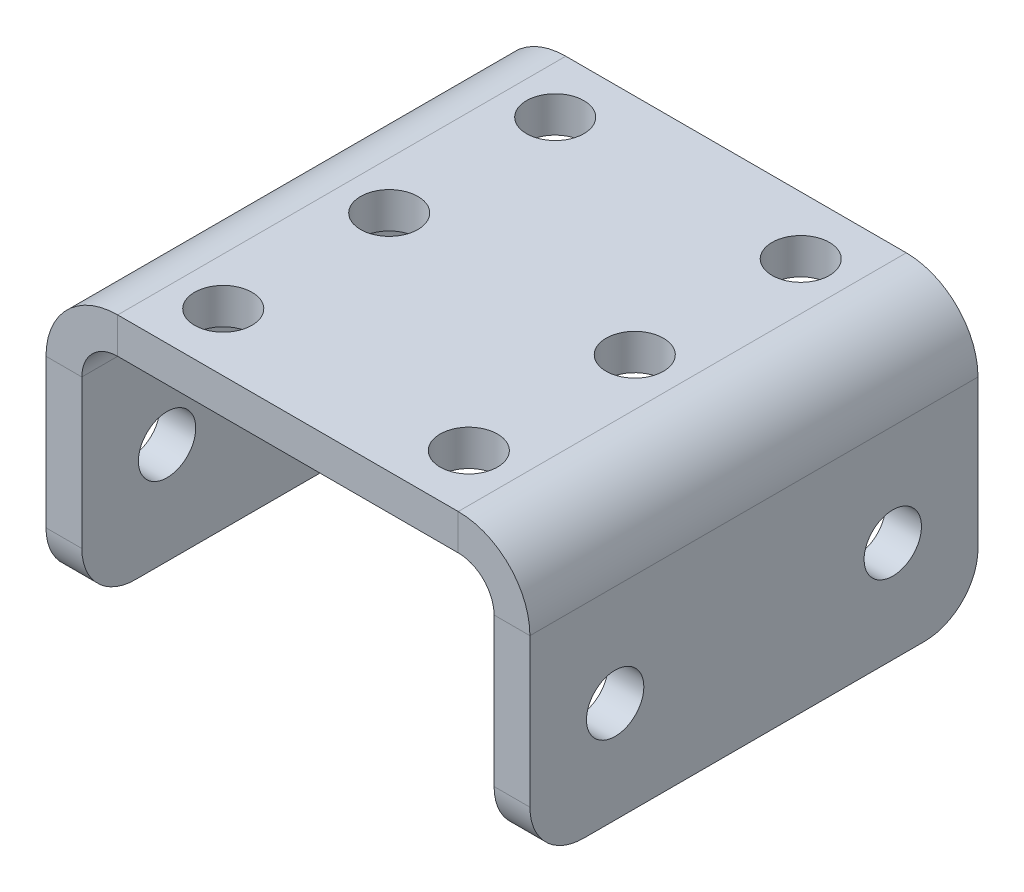
ISO-10303-21;
HEADER;
FILE_DESCRIPTION(('STEP AP214'),'2;1');
FILE_NAME('part.step','',(''),(''),'','','');
FILE_SCHEMA(('AUTOMOTIVE_DESIGN { 1 0 10303 214 1 1 1 1 }'));
ENDSEC;
DATA;
#1=APPLICATION_CONTEXT('core data for automotive mechanical design processes');
#2=APPLICATION_PROTOCOL_DEFINITION('international standard','automotive_design',2000,#1);
#3=PRODUCT_CONTEXT('',#1,'mechanical');
#4=PRODUCT('Part','Part','',(#3));
#5=PRODUCT_RELATED_PRODUCT_CATEGORY('part','',(#4));
#6=PRODUCT_DEFINITION_FORMATION('','',#4);
#7=PRODUCT_DEFINITION_CONTEXT('part definition',#1,'design');
#8=PRODUCT_DEFINITION('design','',#6,#7);
#9=PRODUCT_DEFINITION_SHAPE('','',#8);
#10=(LENGTH_UNIT() NAMED_UNIT(*) SI_UNIT(.MILLI.,.METRE.));
#11=(NAMED_UNIT(*) PLANE_ANGLE_UNIT() SI_UNIT($,.RADIAN.));
#12=(NAMED_UNIT(*) SI_UNIT($,.STERADIAN.) SOLID_ANGLE_UNIT());
#13=UNCERTAINTY_MEASURE_WITH_UNIT(LENGTH_MEASURE(1.E-05),#10,'distance_accuracy_value','');
#14=(GEOMETRIC_REPRESENTATION_CONTEXT(3) GLOBAL_UNCERTAINTY_ASSIGNED_CONTEXT((#13)) GLOBAL_UNIT_ASSIGNED_CONTEXT((#10,
#11,#12)) REPRESENTATION_CONTEXT('',''));
#15=CARTESIAN_POINT('',(0.,0.,0.));
#16=DIRECTION('',(0.,0.,1.));
#17=DIRECTION('',(1.,0.,0.));
#18=AXIS2_PLACEMENT_3D('',#15,#16,#17);
#19=CARTESIAN_POINT('',(-25.5,-2.,12.5));
#20=DIRECTION('',(0.,0.,1.));
#21=DIRECTION('',(1.,0.,0.));
#22=AXIS2_PLACEMENT_3D('',#19,#20,#21);
#23=PLANE('',#22);
#24=DIRECTION('',(1.,0.,0.));
#25=VECTOR('',#24,1.);
#26=CARTESIAN_POINT('',(-25.5,-2.,12.5));
#27=LINE('',#26,#25);
#28=CARTESIAN_POINT('',(-9.5,-2.,12.5));
#29=VERTEX_POINT('',#28);
#30=CARTESIAN_POINT('',(9.50000000000001,-2.,12.5));
#31=VERTEX_POINT('',#30);
#32=EDGE_CURVE('E275',#29,#31,#27,.T.);
#33=ORIENTED_EDGE('',*,*,#32,.T.);
#34=DIRECTION('',(0.,1.,0.));
#35=VECTOR('',#34,1.);
#36=CARTESIAN_POINT('',(9.50000000000001,-2.,12.5));
#37=LINE('',#36,#35);
#38=CARTESIAN_POINT('',(9.50000000000001,0.,12.5));
#39=VERTEX_POINT('',#38);
#40=EDGE_CURVE('E283',#31,#39,#37,.T.);
#41=ORIENTED_EDGE('',*,*,#40,.T.);
#42=DIRECTION('',(1.,0.,0.));
#43=VECTOR('',#42,1.);
#44=CARTESIAN_POINT('',(-25.5,0.,12.5));
#45=LINE('',#44,#43);
#46=CARTESIAN_POINT('',(-9.5,0.,12.5));
#47=VERTEX_POINT('',#46);
#48=EDGE_CURVE('E238',#47,#39,#45,.T.);
#49=ORIENTED_EDGE('',*,*,#48,.F.);
#50=DIRECTION('',(0.,1.,0.));
#51=VECTOR('',#50,1.);
#52=CARTESIAN_POINT('',(-9.5,-2.,12.5));
#53=LINE('',#52,#51);
#54=EDGE_CURVE('E244',#29,#47,#53,.T.);
#55=ORIENTED_EDGE('',*,*,#54,.F.);
#56=EDGE_LOOP('',(#33,#41,#49,#55));
#57=FACE_BOUND('',#56,.T.);
#58=ADVANCED_FACE('F58',(#57),#23,.T.);
#59=CARTESIAN_POINT('',(-25.5,-2.,-12.5));
#60=DIRECTION('',(0.,0.,-1.));
#61=DIRECTION('',(-1.,0.,0.));
#62=AXIS2_PLACEMENT_3D('',#59,#60,#61);
#63=PLANE('',#62);
#64=DIRECTION('',(-1.,0.,0.));
#65=VECTOR('',#64,1.);
#66=CARTESIAN_POINT('',(-25.5,0.,-12.5));
#67=LINE('',#66,#65);
#68=CARTESIAN_POINT('',(9.50000000000001,0.,-12.5));
#69=VERTEX_POINT('',#68);
#70=CARTESIAN_POINT('',(-9.5,0.,-12.5));
#71=VERTEX_POINT('',#70);
#72=EDGE_CURVE('E239',#69,#71,#67,.T.);
#73=ORIENTED_EDGE('',*,*,#72,.F.);
#74=DIRECTION('',(0.,-1.,0.));
#75=VECTOR('',#74,1.);
#76=CARTESIAN_POINT('',(9.50000000000001,-2.,-12.5));
#77=LINE('',#76,#75);
#78=CARTESIAN_POINT('',(9.50000000000001,-2.,-12.5));
#79=VERTEX_POINT('',#78);
#80=EDGE_CURVE('E278',#69,#79,#77,.T.);
#81=ORIENTED_EDGE('',*,*,#80,.T.);
#82=DIRECTION('',(-1.,0.,0.));
#83=VECTOR('',#82,1.);
#84=CARTESIAN_POINT('',(-25.5,-2.,-12.5));
#85=LINE('',#84,#83);
#86=CARTESIAN_POINT('',(-9.5,-2.,-12.5));
#87=VERTEX_POINT('',#86);
#88=EDGE_CURVE('E243',#79,#87,#85,.T.);
#89=ORIENTED_EDGE('',*,*,#88,.T.);
#90=DIRECTION('',(0.,-1.,0.));
#91=VECTOR('',#90,1.);
#92=CARTESIAN_POINT('',(-9.5,-2.,-12.5));
#93=LINE('',#92,#91);
#94=EDGE_CURVE('E240',#71,#87,#93,.T.);
#95=ORIENTED_EDGE('',*,*,#94,.F.);
#96=EDGE_LOOP('',(#73,#81,#89,#95));
#97=FACE_BOUND('',#96,.T.);
#98=ADVANCED_FACE('F367',(#97),#63,.T.);
#99=CARTESIAN_POINT('',(0.,-2.,0.));
#100=DIRECTION('',(0.,-1.,0.));
#101=DIRECTION('',(0.,0.,-1.));
#102=AXIS2_PLACEMENT_3D('',#99,#100,#101);
#103=PLANE('',#102);
#104=CARTESIAN_POINT('',(6.85,-2.,9.26));
#105=DIRECTION('',(0.,-1.,0.));
#106=DIRECTION('',(0.,0.,-1.));
#107=AXIS2_PLACEMENT_3D('',#104,#105,#106);
#108=CIRCLE('',#107,1.6);
#109=CARTESIAN_POINT('',(6.85,-2.,7.66));
#110=VERTEX_POINT('',#109);
#111=EDGE_CURVE('E525',#110,#110,#108,.T.);
#112=ORIENTED_EDGE('',*,*,#111,.F.);
#113=EDGE_LOOP('',(#112));
#114=FACE_BOUND('',#113,.T.);
#115=CARTESIAN_POINT('',(6.85,-2.,-9.26));
#116=DIRECTION('',(0.,-1.,0.));
#117=DIRECTION('',(0.,0.,-1.));
#118=AXIS2_PLACEMENT_3D('',#115,#116,#117);
#119=CIRCLE('',#118,1.6);
#120=CARTESIAN_POINT('',(6.85,-2.,-10.86));
#121=VERTEX_POINT('',#120);
#122=EDGE_CURVE('E528',#121,#121,#119,.T.);
#123=ORIENTED_EDGE('',*,*,#122,.F.);
#124=EDGE_LOOP('',(#123));
#125=FACE_BOUND('',#124,.T.);
#126=CARTESIAN_POINT('',(-6.85,-2.,-9.26));
#127=DIRECTION('',(0.,-1.,0.));
#128=DIRECTION('',(0.,0.,-1.));
#129=AXIS2_PLACEMENT_3D('',#126,#127,#128);
#130=CIRCLE('',#129,1.6);
#131=CARTESIAN_POINT('',(-6.85,-2.,-10.86));
#132=VERTEX_POINT('',#131);
#133=EDGE_CURVE('E522',#132,#132,#130,.T.);
#134=ORIENTED_EDGE('',*,*,#133,.F.);
#135=EDGE_LOOP('',(#134));
#136=FACE_BOUND('',#135,.T.);
#137=CARTESIAN_POINT('',(-6.85,-2.,0.));
#138=DIRECTION('',(0.,-1.,0.));
#139=DIRECTION('',(0.,0.,-1.));
#140=AXIS2_PLACEMENT_3D('',#137,#138,#139);
#141=CIRCLE('',#140,1.6);
#142=CARTESIAN_POINT('',(-6.85,-2.,-1.6));
#143=VERTEX_POINT('',#142);
#144=EDGE_CURVE('E519',#143,#143,#141,.T.);
#145=ORIENTED_EDGE('',*,*,#144,.F.);
#146=EDGE_LOOP('',(#145));
#147=FACE_BOUND('',#146,.T.);
#148=CARTESIAN_POINT('',(6.85,-2.,0.));
#149=DIRECTION('',(0.,-1.,0.));
#150=DIRECTION('',(0.,0.,-1.));
#151=AXIS2_PLACEMENT_3D('',#148,#149,#150);
#152=CIRCLE('',#151,1.6);
#153=CARTESIAN_POINT('',(6.85,-2.,-1.6));
#154=VERTEX_POINT('',#153);
#155=EDGE_CURVE('E512',#154,#154,#152,.T.);
#156=ORIENTED_EDGE('',*,*,#155,.F.);
#157=EDGE_LOOP('',(#156));
#158=FACE_BOUND('',#157,.T.);
#159=CARTESIAN_POINT('',(-6.85,-2.,9.26));
#160=DIRECTION('',(0.,-1.,0.));
#161=DIRECTION('',(0.,0.,-1.));
#162=AXIS2_PLACEMENT_3D('',#159,#160,#161);
#163=CIRCLE('',#162,1.6);
#164=CARTESIAN_POINT('',(-6.85,-2.,7.66));
#165=VERTEX_POINT('',#164);
#166=EDGE_CURVE('E297',#165,#165,#163,.T.);
#167=ORIENTED_EDGE('',*,*,#166,.F.);
#168=EDGE_LOOP('',(#167));
#169=FACE_BOUND('',#168,.T.);
#170=ORIENTED_EDGE('',*,*,#88,.F.);
#171=DIRECTION('',(0.,0.,1.));
#172=VECTOR('',#171,1.);
#173=CARTESIAN_POINT('',(9.50000000000001,-2.,0.));
#174=LINE('',#173,#172);
#175=EDGE_CURVE('E211',#79,#31,#174,.T.);
#176=ORIENTED_EDGE('',*,*,#175,.T.);
#177=ORIENTED_EDGE('',*,*,#32,.F.);
#178=DIRECTION('',(0.,0.,1.));
#179=VECTOR('',#178,1.);
#180=CARTESIAN_POINT('',(-9.5,-2.,0.));
#181=LINE('',#180,#179);
#182=EDGE_CURVE('E230',#87,#29,#181,.T.);
#183=ORIENTED_EDGE('',*,*,#182,.F.);
#184=EDGE_LOOP('',(#170,#176,#177,#183));
#185=FACE_BOUND('',#184,.T.);
#186=ADVANCED_FACE('F378',(#114,#125,#136,#147,#158,#169,#185),#103,.T.);
#187=CARTESIAN_POINT('',(-11.5,-15.2876110196153,12.5));
#188=DIRECTION('',(0.,0.,1.));
#189=DIRECTION('',(0.,1.,0.));
#190=AXIS2_PLACEMENT_3D('',#187,#188,#189);
#191=PLANE('',#190);
#192=DIRECTION('',(0.,1.,0.));
#193=VECTOR('',#192,1.);
#194=CARTESIAN_POINT('',(-13.5,-15.2876110196153,12.5));
#195=LINE('',#194,#193);
#196=CARTESIAN_POINT('',(-13.5,-12.2876110196153,12.5));
#197=VERTEX_POINT('',#196);
#198=CARTESIAN_POINT('',(-13.5,-4.00000000000001,12.5));
#199=VERTEX_POINT('',#198);
#200=EDGE_CURVE('E257',#197,#199,#195,.T.);
#201=ORIENTED_EDGE('',*,*,#200,.F.);
#202=DIRECTION('',(-1.,0.,0.));
#203=VECTOR('',#202,1.);
#204=CARTESIAN_POINT('',(-11.5,-12.2876110196153,12.5));
#205=LINE('',#204,#203);
#206=CARTESIAN_POINT('',(-11.5,-12.2876110196153,12.5));
#207=VERTEX_POINT('',#206);
#208=EDGE_CURVE('E81',#197,#207,#205,.F.);
#209=ORIENTED_EDGE('',*,*,#208,.T.);
#210=DIRECTION('',(0.,1.,0.));
#211=VECTOR('',#210,1.);
#212=CARTESIAN_POINT('',(-11.5,-15.2876110196153,12.5));
#213=LINE('',#212,#211);
#214=CARTESIAN_POINT('',(-11.5,-4.00000000000001,12.5));
#215=VERTEX_POINT('',#214);
#216=EDGE_CURVE('E252',#207,#215,#213,.T.);
#217=ORIENTED_EDGE('',*,*,#216,.T.);
#218=DIRECTION('',(-1.,0.,0.));
#219=VECTOR('',#218,1.);
#220=CARTESIAN_POINT('',(-11.5,-4.00000000000001,12.5));
#221=LINE('',#220,#219);
#222=EDGE_CURVE('E268',#215,#199,#221,.T.);
#223=ORIENTED_EDGE('',*,*,#222,.T.);
#224=EDGE_LOOP('',(#201,#209,#217,#223));
#225=FACE_BOUND('',#224,.T.);
#226=ADVANCED_FACE('F351',(#225),#191,.T.);
#227=CARTESIAN_POINT('',(-11.5,-15.2876110196153,-12.5));
#228=DIRECTION('',(0.,0.,-1.));
#229=DIRECTION('',(0.,-1.,0.));
#230=AXIS2_PLACEMENT_3D('',#227,#228,#229);
#231=PLANE('',#230);
#232=DIRECTION('',(0.,-1.,0.));
#233=VECTOR('',#232,1.);
#234=CARTESIAN_POINT('',(-11.5,-15.2876110196153,-12.5));
#235=LINE('',#234,#233);
#236=CARTESIAN_POINT('',(-11.5,-4.00000000000001,-12.5));
#237=VERTEX_POINT('',#236);
#238=CARTESIAN_POINT('',(-11.5,-12.2876110196153,-12.5));
#239=VERTEX_POINT('',#238);
#240=EDGE_CURVE('E253',#237,#239,#235,.T.);
#241=ORIENTED_EDGE('',*,*,#240,.T.);
#242=DIRECTION('',(-1.,0.,0.));
#243=VECTOR('',#242,1.);
#244=CARTESIAN_POINT('',(-11.5,-12.2876110196153,-12.5));
#245=LINE('',#244,#243);
#246=CARTESIAN_POINT('',(-13.5,-12.2876110196153,-12.5));
#247=VERTEX_POINT('',#246);
#248=EDGE_CURVE('E12',#239,#247,#245,.T.);
#249=ORIENTED_EDGE('',*,*,#248,.T.);
#250=DIRECTION('',(0.,-1.,0.));
#251=VECTOR('',#250,1.);
#252=CARTESIAN_POINT('',(-13.5,-15.2876110196153,-12.5));
#253=LINE('',#252,#251);
#254=CARTESIAN_POINT('',(-13.5,-4.00000000000001,-12.5));
#255=VERTEX_POINT('',#254);
#256=EDGE_CURVE('E258',#255,#247,#253,.T.);
#257=ORIENTED_EDGE('',*,*,#256,.F.);
#258=DIRECTION('',(1.,0.,0.));
#259=VECTOR('',#258,1.);
#260=CARTESIAN_POINT('',(-11.5,-4.00000000000001,-12.5));
#261=LINE('',#260,#259);
#262=EDGE_CURVE('E262',#255,#237,#261,.T.);
#263=ORIENTED_EDGE('',*,*,#262,.T.);
#264=EDGE_LOOP('',(#241,#249,#257,#263));
#265=FACE_BOUND('',#264,.T.);
#266=ADVANCED_FACE('F439',(#265),#231,.T.);
#267=CARTESIAN_POINT('',(-11.5,10.2123889803847,0.));
#268=DIRECTION('',(1.,0.,0.));
#269=DIRECTION('',(0.,0.,-1.));
#270=AXIS2_PLACEMENT_3D('',#267,#268,#269);
#271=PLANE('',#270);
#272=CARTESIAN_POINT('',(-11.5,-9.64380550980757,7.745));
#273=DIRECTION('',(1.,0.,0.));
#274=DIRECTION('',(0.,1.,0.));
#275=AXIS2_PLACEMENT_3D('',#272,#273,#274);
#276=CIRCLE('',#275,1.6);
#277=CARTESIAN_POINT('',(-11.5,-8.04380550980757,7.745));
#278=VERTEX_POINT('',#277);
#279=EDGE_CURVE('E199',#278,#278,#276,.T.);
#280=ORIENTED_EDGE('',*,*,#279,.F.);
#281=EDGE_LOOP('',(#280));
#282=FACE_BOUND('',#281,.T.);
#283=CARTESIAN_POINT('',(-11.5,-9.64380550980757,-7.745));
#284=DIRECTION('',(1.,0.,0.));
#285=DIRECTION('',(0.,1.,0.));
#286=AXIS2_PLACEMENT_3D('',#283,#284,#285);
#287=CIRCLE('',#286,1.6);
#288=CARTESIAN_POINT('',(-11.5,-8.04380550980757,-7.745));
#289=VERTEX_POINT('',#288);
#290=EDGE_CURVE('E546',#289,#289,#287,.T.);
#291=ORIENTED_EDGE('',*,*,#290,.F.);
#292=EDGE_LOOP('',(#291));
#293=FACE_BOUND('',#292,.T.);
#294=ORIENTED_EDGE('',*,*,#216,.F.);
#295=CARTESIAN_POINT('',(-11.5,-12.2876110196153,9.5));
#296=DIRECTION('',(1.,0.,0.));
#297=DIRECTION('',(0.,1.,0.));
#298=AXIS2_PLACEMENT_3D('',#295,#296,#297);
#299=CIRCLE('',#298,3.);
#300=CARTESIAN_POINT('',(-11.5,-15.2876110196153,9.5));
#301=VERTEX_POINT('',#300);
#302=EDGE_CURVE('E66',#207,#301,#299,.T.);
#303=ORIENTED_EDGE('',*,*,#302,.T.);
#304=DIRECTION('',(0.,0.,1.));
#305=VECTOR('',#304,1.);
#306=CARTESIAN_POINT('',(-11.5,-15.2876110196153,12.5));
#307=LINE('',#306,#305);
#308=CARTESIAN_POINT('',(-11.5,-15.2876110196153,-9.5));
#309=VERTEX_POINT('',#308);
#310=EDGE_CURVE('E249',#309,#301,#307,.T.);
#311=ORIENTED_EDGE('',*,*,#310,.F.);
#312=CARTESIAN_POINT('',(-11.5,-12.2876110196153,-9.5));
#313=DIRECTION('',(1.,0.,0.));
#314=DIRECTION('',(0.,1.,0.));
#315=AXIS2_PLACEMENT_3D('',#312,#313,#314);
#316=CIRCLE('',#315,3.);
#317=EDGE_CURVE('E73',#309,#239,#316,.T.);
#318=ORIENTED_EDGE('',*,*,#317,.T.);
#319=ORIENTED_EDGE('',*,*,#240,.F.);
#320=DIRECTION('',(0.,0.,1.));
#321=VECTOR('',#320,1.);
#322=CARTESIAN_POINT('',(-11.5,-4.00000000000001,0.));
#323=LINE('',#322,#321);
#324=EDGE_CURVE('E259',#237,#215,#323,.T.);
#325=ORIENTED_EDGE('',*,*,#324,.T.);
#326=EDGE_LOOP('',(#294,#303,#311,#318,#319,#325));
#327=FACE_BOUND('',#326,.T.);
#328=ADVANCED_FACE('F340',(#282,#293,#327),#271,.T.);
#329=CARTESIAN_POINT('',(-11.5,-15.2876110196153,12.5));
#330=DIRECTION('',(0.,-1.,0.));
#331=DIRECTION('',(0.,0.,1.));
#332=AXIS2_PLACEMENT_3D('',#329,#330,#331);
#333=PLANE('',#332);
#334=ORIENTED_EDGE('',*,*,#310,.T.);
#335=DIRECTION('',(-1.,0.,0.));
#336=VECTOR('',#335,1.);
#337=CARTESIAN_POINT('',(-11.5,-15.2876110196153,9.5));
#338=LINE('',#337,#336);
#339=CARTESIAN_POINT('',(-13.5,-15.2876110196153,9.5));
#340=VERTEX_POINT('',#339);
#341=EDGE_CURVE('E331',#301,#340,#338,.T.);
#342=ORIENTED_EDGE('',*,*,#341,.T.);
#343=DIRECTION('',(0.,0.,1.));
#344=VECTOR('',#343,1.);
#345=CARTESIAN_POINT('',(-13.5,-15.2876110196153,12.5));
#346=LINE('',#345,#344);
#347=CARTESIAN_POINT('',(-13.5,-15.2876110196153,-9.5));
#348=VERTEX_POINT('',#347);
#349=EDGE_CURVE('E254',#348,#340,#346,.T.);
#350=ORIENTED_EDGE('',*,*,#349,.F.);
#351=DIRECTION('',(-1.,0.,0.));
#352=VECTOR('',#351,1.);
#353=CARTESIAN_POINT('',(-11.5,-15.2876110196153,-9.5));
#354=LINE('',#353,#352);
#355=EDGE_CURVE('E329',#348,#309,#354,.F.);
#356=ORIENTED_EDGE('',*,*,#355,.T.);
#357=EDGE_LOOP('',(#334,#342,#350,#356));
#358=FACE_BOUND('',#357,.T.);
#359=ADVANCED_FACE('F344',(#358),#333,.T.);
#360=CARTESIAN_POINT('',(-13.5,10.2123889803847,0.));
#361=DIRECTION('',(1.,0.,0.));
#362=DIRECTION('',(0.,0.,-1.));
#363=AXIS2_PLACEMENT_3D('',#360,#361,#362);
#364=PLANE('',#363);
#365=CARTESIAN_POINT('',(-13.5,-9.64380550980756,7.745));
#366=DIRECTION('',(1.,0.,0.));
#367=DIRECTION('',(0.,1.,0.));
#368=AXIS2_PLACEMENT_3D('',#365,#366,#367);
#369=CIRCLE('',#368,1.6);
#370=CARTESIAN_POINT('',(-13.5,-8.04380550980756,7.745));
#371=VERTEX_POINT('',#370);
#372=EDGE_CURVE('E552',#371,#371,#369,.T.);
#373=ORIENTED_EDGE('',*,*,#372,.T.);
#374=EDGE_LOOP('',(#373));
#375=FACE_BOUND('',#374,.T.);
#376=CARTESIAN_POINT('',(-13.5,-9.64380550980756,-7.745));
#377=DIRECTION('',(1.,0.,0.));
#378=DIRECTION('',(0.,1.,0.));
#379=AXIS2_PLACEMENT_3D('',#376,#377,#378);
#380=CIRCLE('',#379,1.6);
#381=CARTESIAN_POINT('',(-13.5,-8.04380550980756,-7.745));
#382=VERTEX_POINT('',#381);
#383=EDGE_CURVE('E543',#382,#382,#380,.T.);
#384=ORIENTED_EDGE('',*,*,#383,.T.);
#385=EDGE_LOOP('',(#384));
#386=FACE_BOUND('',#385,.T.);
#387=ORIENTED_EDGE('',*,*,#349,.T.);
#388=CARTESIAN_POINT('',(-13.5,-12.2876110196153,9.5));
#389=DIRECTION('',(1.,0.,0.));
#390=DIRECTION('',(0.,1.,0.));
#391=AXIS2_PLACEMENT_3D('',#388,#389,#390);
#392=CIRCLE('',#391,3.);
#393=EDGE_CURVE('E336',#340,#197,#392,.F.);
#394=ORIENTED_EDGE('',*,*,#393,.T.);
#395=ORIENTED_EDGE('',*,*,#200,.T.);
#396=DIRECTION('',(0.,0.,1.));
#397=VECTOR('',#396,1.);
#398=CARTESIAN_POINT('',(-13.5,-4.00000000000001,0.));
#399=LINE('',#398,#397);
#400=EDGE_CURVE('E265',#255,#199,#399,.T.);
#401=ORIENTED_EDGE('',*,*,#400,.F.);
#402=ORIENTED_EDGE('',*,*,#256,.T.);
#403=CARTESIAN_POINT('',(-13.5,-12.2876110196153,-9.5));
#404=DIRECTION('',(1.,0.,0.));
#405=DIRECTION('',(0.,1.,0.));
#406=AXIS2_PLACEMENT_3D('',#403,#404,#405);
#407=CIRCLE('',#406,3.);
#408=EDGE_CURVE('E334',#247,#348,#407,.F.);
#409=ORIENTED_EDGE('',*,*,#408,.T.);
#410=EDGE_LOOP('',(#387,#394,#395,#401,#402,#409));
#411=FACE_BOUND('',#410,.T.);
#412=ADVANCED_FACE('F349',(#375,#386,#411),#364,.F.);
#413=CARTESIAN_POINT('',(0.,0.,0.));
#414=DIRECTION('',(0.,-1.,0.));
#415=DIRECTION('',(0.,0.,-1.));
#416=AXIS2_PLACEMENT_3D('',#413,#414,#415);
#417=PLANE('',#416);
#418=CARTESIAN_POINT('',(6.85,0.,9.26));
#419=DIRECTION('',(0.,-1.,0.));
#420=DIRECTION('',(0.,0.,-1.));
#421=AXIS2_PLACEMENT_3D('',#418,#419,#420);
#422=CIRCLE('',#421,1.6);
#423=CARTESIAN_POINT('',(6.85,0.,7.66));
#424=VERTEX_POINT('',#423);
#425=EDGE_CURVE('E309',#424,#424,#422,.T.);
#426=ORIENTED_EDGE('',*,*,#425,.T.);
#427=EDGE_LOOP('',(#426));
#428=FACE_BOUND('',#427,.T.);
#429=CARTESIAN_POINT('',(6.85,0.,-9.26));
#430=DIRECTION('',(0.,-1.,0.));
#431=DIRECTION('',(0.,0.,-1.));
#432=AXIS2_PLACEMENT_3D('',#429,#430,#431);
#433=CIRCLE('',#432,1.6);
#434=CARTESIAN_POINT('',(6.85,0.,-10.86));
#435=VERTEX_POINT('',#434);
#436=EDGE_CURVE('E306',#435,#435,#433,.T.);
#437=ORIENTED_EDGE('',*,*,#436,.T.);
#438=EDGE_LOOP('',(#437));
#439=FACE_BOUND('',#438,.T.);
#440=CARTESIAN_POINT('',(-6.85,0.,-9.26));
#441=DIRECTION('',(0.,-1.,0.));
#442=DIRECTION('',(0.,0.,-1.));
#443=AXIS2_PLACEMENT_3D('',#440,#441,#442);
#444=CIRCLE('',#443,1.6);
#445=CARTESIAN_POINT('',(-6.85,0.,-10.86));
#446=VERTEX_POINT('',#445);
#447=EDGE_CURVE('E303',#446,#446,#444,.T.);
#448=ORIENTED_EDGE('',*,*,#447,.T.);
#449=EDGE_LOOP('',(#448));
#450=FACE_BOUND('',#449,.T.);
#451=CARTESIAN_POINT('',(-6.85,0.,0.));
#452=DIRECTION('',(0.,-1.,0.));
#453=DIRECTION('',(0.,0.,-1.));
#454=AXIS2_PLACEMENT_3D('',#451,#452,#453);
#455=CIRCLE('',#454,1.6);
#456=CARTESIAN_POINT('',(-6.85,0.,-1.6));
#457=VERTEX_POINT('',#456);
#458=EDGE_CURVE('E300',#457,#457,#455,.T.);
#459=ORIENTED_EDGE('',*,*,#458,.T.);
#460=EDGE_LOOP('',(#459));
#461=FACE_BOUND('',#460,.T.);
#462=CARTESIAN_POINT('',(6.85,0.,0.));
#463=DIRECTION('',(0.,-1.,0.));
#464=DIRECTION('',(0.,0.,-1.));
#465=AXIS2_PLACEMENT_3D('',#462,#463,#464);
#466=CIRCLE('',#465,1.6);
#467=CARTESIAN_POINT('',(6.85,0.,-1.6));
#468=VERTEX_POINT('',#467);
#469=EDGE_CURVE('E296',#468,#468,#466,.T.);
#470=ORIENTED_EDGE('',*,*,#469,.T.);
#471=EDGE_LOOP('',(#470));
#472=FACE_BOUND('',#471,.T.);
#473=CARTESIAN_POINT('',(-6.85,0.,9.26));
#474=DIRECTION('',(0.,-1.,0.));
#475=DIRECTION('',(0.,0.,-1.));
#476=AXIS2_PLACEMENT_3D('',#473,#474,#475);
#477=CIRCLE('',#476,1.6);
#478=CARTESIAN_POINT('',(-6.85,0.,7.66));
#479=VERTEX_POINT('',#478);
#480=EDGE_CURVE('E293',#479,#479,#477,.T.);
#481=ORIENTED_EDGE('',*,*,#480,.T.);
#482=EDGE_LOOP('',(#481));
#483=FACE_BOUND('',#482,.T.);
#484=DIRECTION('',(0.,0.,1.));
#485=VECTOR('',#484,1.);
#486=CARTESIAN_POINT('',(9.50000000000001,0.,0.));
#487=LINE('',#486,#485);
#488=EDGE_CURVE('E281',#69,#39,#487,.T.);
#489=ORIENTED_EDGE('',*,*,#488,.F.);
#490=ORIENTED_EDGE('',*,*,#72,.T.);
#491=DIRECTION('',(0.,0.,1.));
#492=VECTOR('',#491,1.);
#493=CARTESIAN_POINT('',(-9.5,0.,0.));
#494=LINE('',#493,#492);
#495=EDGE_CURVE('E235',#71,#47,#494,.T.);
#496=ORIENTED_EDGE('',*,*,#495,.T.);
#497=ORIENTED_EDGE('',*,*,#48,.T.);
#498=EDGE_LOOP('',(#489,#490,#496,#497));
#499=FACE_BOUND('',#498,.T.);
#500=ADVANCED_FACE('F374',(#428,#439,#450,#461,#472,#483,#499),#417,.F.);
#501=CARTESIAN_POINT('',(-9.5,-4.,-12.5));
#502=DIRECTION('',(0.,0.,1.));
#503=DIRECTION('',(1.,0.,0.));
#504=AXIS2_PLACEMENT_3D('',#501,#502,#503);
#505=PLANE('',#504);
#506=ORIENTED_EDGE('',*,*,#262,.F.);
#507=CARTESIAN_POINT('',(-9.5,-4.,-12.5));
#508=DIRECTION('',(0.,0.,-1.));
#509=DIRECTION('',(-1.,0.,0.));
#510=AXIS2_PLACEMENT_3D('',#507,#508,#509);
#511=CIRCLE('',#510,4.);
#512=EDGE_CURVE('E216',#255,#71,#511,.T.);
#513=ORIENTED_EDGE('',*,*,#512,.T.);
#514=ORIENTED_EDGE('',*,*,#94,.T.);
#515=CARTESIAN_POINT('',(-9.5,-4.,-12.5));
#516=DIRECTION('',(0.,0.,-1.));
#517=DIRECTION('',(1.,0.,0.));
#518=AXIS2_PLACEMENT_3D('',#515,#516,#517);
#519=CIRCLE('',#518,2.);
#520=EDGE_CURVE('E223',#237,#87,#519,.T.);
#521=ORIENTED_EDGE('',*,*,#520,.F.);
#522=EDGE_LOOP('',(#506,#513,#514,#521));
#523=FACE_BOUND('',#522,.T.);
#524=ADVANCED_FACE('F361',(#523),#505,.F.);
#525=CARTESIAN_POINT('',(-9.5,-4.,12.5));
#526=DIRECTION('',(0.,0.,-1.));
#527=DIRECTION('',(-1.,0.,0.));
#528=AXIS2_PLACEMENT_3D('',#525,#526,#527);
#529=PLANE('',#528);
#530=CARTESIAN_POINT('',(-9.5,-4.,12.5));
#531=DIRECTION('',(0.,0.,-1.));
#532=DIRECTION('',(-1.,0.,0.));
#533=AXIS2_PLACEMENT_3D('',#530,#531,#532);
#534=CIRCLE('',#533,4.);
#535=EDGE_CURVE('E227',#47,#199,#534,.F.);
#536=ORIENTED_EDGE('',*,*,#535,.T.);
#537=ORIENTED_EDGE('',*,*,#222,.F.);
#538=CARTESIAN_POINT('',(-9.5,-4.,12.5));
#539=DIRECTION('',(0.,0.,1.));
#540=DIRECTION('',(-1.,0.,0.));
#541=AXIS2_PLACEMENT_3D('',#538,#539,#540);
#542=CIRCLE('',#541,2.);
#543=EDGE_CURVE('E226',#29,#215,#542,.T.);
#544=ORIENTED_EDGE('',*,*,#543,.F.);
#545=ORIENTED_EDGE('',*,*,#54,.T.);
#546=EDGE_LOOP('',(#536,#537,#544,#545));
#547=FACE_BOUND('',#546,.T.);
#548=ADVANCED_FACE('F355',(#547),#529,.F.);
#549=CARTESIAN_POINT('',(-9.5,-4.,25.5187501634083));
#550=DIRECTION('',(0.,0.,-1.));
#551=DIRECTION('',(-1.,0.,0.));
#552=AXIS2_PLACEMENT_3D('',#549,#550,#551);
#553=CYLINDRICAL_SURFACE('',#552,2.);
#554=ORIENTED_EDGE('',*,*,#182,.T.);
#555=ORIENTED_EDGE('',*,*,#543,.T.);
#556=ORIENTED_EDGE('',*,*,#324,.F.);
#557=ORIENTED_EDGE('',*,*,#520,.T.);
#558=EDGE_LOOP('',(#554,#555,#556,#557));
#559=FACE_BOUND('',#558,.T.);
#560=ADVANCED_FACE('F359',(#559),#553,.F.);
#561=CARTESIAN_POINT('',(-9.5,-4.,25.5187501634083));
#562=DIRECTION('',(0.,0.,-1.));
#563=DIRECTION('',(-1.,0.,0.));
#564=AXIS2_PLACEMENT_3D('',#561,#562,#563);
#565=CYLINDRICAL_SURFACE('',#564,4.);
#566=ORIENTED_EDGE('',*,*,#495,.F.);
#567=ORIENTED_EDGE('',*,*,#512,.F.);
#568=ORIENTED_EDGE('',*,*,#400,.T.);
#569=ORIENTED_EDGE('',*,*,#535,.F.);
#570=EDGE_LOOP('',(#566,#567,#568,#569));
#571=FACE_BOUND('',#570,.T.);
#572=ADVANCED_FACE('F371',(#571),#565,.T.);
#573=CARTESIAN_POINT('',(9.50000000000001,-4.,-12.5));
#574=DIRECTION('',(0.,0.,1.));
#575=DIRECTION('',(1.,0.,0.));
#576=AXIS2_PLACEMENT_3D('',#573,#574,#575);
#577=PLANE('',#576);
#578=ORIENTED_EDGE('',*,*,#80,.F.);
#579=CARTESIAN_POINT('',(9.50000000000001,-4.,-12.5));
#580=DIRECTION('',(0.,0.,1.));
#581=DIRECTION('',(1.,0.,0.));
#582=AXIS2_PLACEMENT_3D('',#579,#580,#581);
#583=CIRCLE('',#582,4.);
#584=CARTESIAN_POINT('',(13.5,-4.00000000000001,-12.5));
#585=VERTEX_POINT('',#584);
#586=EDGE_CURVE('E207',#69,#585,#583,.F.);
#587=ORIENTED_EDGE('',*,*,#586,.T.);
#588=DIRECTION('',(-1.,0.,0.));
#589=VECTOR('',#588,1.);
#590=CARTESIAN_POINT('',(11.5,-4.00000000000001,-12.5));
#591=LINE('',#590,#589);
#592=CARTESIAN_POINT('',(11.5,-4.00000000000001,-12.5));
#593=VERTEX_POINT('',#592);
#594=EDGE_CURVE('E179',#585,#593,#591,.T.);
#595=ORIENTED_EDGE('',*,*,#594,.T.);
#596=CARTESIAN_POINT('',(9.50000000000001,-4.,-12.5));
#597=DIRECTION('',(0.,0.,-1.));
#598=DIRECTION('',(1.,0.,0.));
#599=AXIS2_PLACEMENT_3D('',#596,#597,#598);
#600=CIRCLE('',#599,2.);
#601=EDGE_CURVE('E204',#79,#593,#600,.T.);
#602=ORIENTED_EDGE('',*,*,#601,.F.);
#603=EDGE_LOOP('',(#578,#587,#595,#602));
#604=FACE_BOUND('',#603,.T.);
#605=ADVANCED_FACE('F203',(#604),#577,.F.);
#606=CARTESIAN_POINT('',(9.50000000000001,-4.,12.5));
#607=DIRECTION('',(0.,0.,-1.));
#608=DIRECTION('',(-1.,0.,0.));
#609=AXIS2_PLACEMENT_3D('',#606,#607,#608);
#610=PLANE('',#609);
#611=DIRECTION('',(1.,0.,0.));
#612=VECTOR('',#611,1.);
#613=CARTESIAN_POINT('',(11.5,-4.00000000000001,12.5));
#614=LINE('',#613,#612);
#615=CARTESIAN_POINT('',(11.5,-4.00000000000001,12.5));
#616=VERTEX_POINT('',#615);
#617=CARTESIAN_POINT('',(13.5,-4.00000000000001,12.5));
#618=VERTEX_POINT('',#617);
#619=EDGE_CURVE('E198',#616,#618,#614,.T.);
#620=ORIENTED_EDGE('',*,*,#619,.T.);
#621=CARTESIAN_POINT('',(9.50000000000001,-4.,12.5));
#622=DIRECTION('',(0.,0.,1.));
#623=DIRECTION('',(1.,0.,0.));
#624=AXIS2_PLACEMENT_3D('',#621,#622,#623);
#625=CIRCLE('',#624,4.);
#626=EDGE_CURVE('E214',#618,#39,#625,.T.);
#627=ORIENTED_EDGE('',*,*,#626,.T.);
#628=ORIENTED_EDGE('',*,*,#40,.F.);
#629=CARTESIAN_POINT('',(9.50000000000001,-4.,12.5));
#630=DIRECTION('',(0.,0.,1.));
#631=DIRECTION('',(-1.,0.,0.));
#632=AXIS2_PLACEMENT_3D('',#629,#630,#631);
#633=CIRCLE('',#632,2.);
#634=EDGE_CURVE('E213',#616,#31,#633,.T.);
#635=ORIENTED_EDGE('',*,*,#634,.F.);
#636=EDGE_LOOP('',(#620,#627,#628,#635));
#637=FACE_BOUND('',#636,.T.);
#638=ADVANCED_FACE('F396',(#637),#610,.F.);
#639=CARTESIAN_POINT('',(9.50000000000001,-4.,-25.5187501634083));
#640=DIRECTION('',(0.,0.,1.));
#641=DIRECTION('',(1.,0.,0.));
#642=AXIS2_PLACEMENT_3D('',#639,#640,#641);
#643=CYLINDRICAL_SURFACE('',#642,2.);
#644=ORIENTED_EDGE('',*,*,#634,.T.);
#645=ORIENTED_EDGE('',*,*,#175,.F.);
#646=ORIENTED_EDGE('',*,*,#601,.T.);
#647=DIRECTION('',(0.,0.,1.));
#648=VECTOR('',#647,1.);
#649=CARTESIAN_POINT('',(11.5,-4.00000000000001,0.));
#650=LINE('',#649,#648);
#651=EDGE_CURVE('E190',#593,#616,#650,.T.);
#652=ORIENTED_EDGE('',*,*,#651,.T.);
#653=EDGE_LOOP('',(#644,#645,#646,#652));
#654=FACE_BOUND('',#653,.T.);
#655=ADVANCED_FACE('F209',(#654),#643,.F.);
#656=CARTESIAN_POINT('',(9.50000000000001,-4.,-25.5187501634083));
#657=DIRECTION('',(0.,0.,1.));
#658=DIRECTION('',(1.,0.,0.));
#659=AXIS2_PLACEMENT_3D('',#656,#657,#658);
#660=CYLINDRICAL_SURFACE('',#659,4.);
#661=ORIENTED_EDGE('',*,*,#626,.F.);
#662=DIRECTION('',(0.,0.,1.));
#663=VECTOR('',#662,1.);
#664=CARTESIAN_POINT('',(13.5,-4.00000000000001,0.));
#665=LINE('',#664,#663);
#666=EDGE_CURVE('E383',#585,#618,#665,.T.);
#667=ORIENTED_EDGE('',*,*,#666,.F.);
#668=ORIENTED_EDGE('',*,*,#586,.F.);
#669=ORIENTED_EDGE('',*,*,#488,.T.);
#670=EDGE_LOOP('',(#661,#667,#668,#669));
#671=FACE_BOUND('',#670,.T.);
#672=ADVANCED_FACE('F381',(#671),#660,.T.);
#673=CARTESIAN_POINT('',(11.5,-15.2876110196153,12.5));
#674=DIRECTION('',(0.,-1.,0.));
#675=DIRECTION('',(0.,0.,-1.));
#676=AXIS2_PLACEMENT_3D('',#673,#674,#675);
#677=PLANE('',#676);
#678=DIRECTION('',(0.,0.,-1.));
#679=VECTOR('',#678,1.);
#680=CARTESIAN_POINT('',(11.5,-15.2876110196153,12.5));
#681=LINE('',#680,#679);
#682=CARTESIAN_POINT('',(11.5,-15.2876110196153,9.5));
#683=VERTEX_POINT('',#682);
#684=CARTESIAN_POINT('',(11.5,-15.2876110196153,-9.5));
#685=VERTEX_POINT('',#684);
#686=EDGE_CURVE('E186',#683,#685,#681,.T.);
#687=ORIENTED_EDGE('',*,*,#686,.T.);
#688=DIRECTION('',(1.,0.,0.));
#689=VECTOR('',#688,1.);
#690=CARTESIAN_POINT('',(11.5,-15.2876110196153,-9.5));
#691=LINE('',#690,#689);
#692=CARTESIAN_POINT('',(13.5,-15.2876110196153,-9.5));
#693=VERTEX_POINT('',#692);
#694=EDGE_CURVE('E314',#685,#693,#691,.T.);
#695=ORIENTED_EDGE('',*,*,#694,.T.);
#696=DIRECTION('',(0.,0.,-1.));
#697=VECTOR('',#696,1.);
#698=CARTESIAN_POINT('',(13.5,-15.2876110196153,12.5));
#699=LINE('',#698,#697);
#700=CARTESIAN_POINT('',(13.5,-15.2876110196153,9.5));
#701=VERTEX_POINT('',#700);
#702=EDGE_CURVE('E389',#701,#693,#699,.T.);
#703=ORIENTED_EDGE('',*,*,#702,.F.);
#704=DIRECTION('',(1.,0.,0.));
#705=VECTOR('',#704,1.);
#706=CARTESIAN_POINT('',(11.5,-15.2876110196153,9.5));
#707=LINE('',#706,#705);
#708=EDGE_CURVE('E286',#701,#683,#707,.F.);
#709=ORIENTED_EDGE('',*,*,#708,.T.);
#710=EDGE_LOOP('',(#687,#695,#703,#709));
#711=FACE_BOUND('',#710,.T.);
#712=ADVANCED_FACE('F406',(#711),#677,.T.);
#713=CARTESIAN_POINT('',(11.5000000000001,10.2123889803847,0.));
#714=DIRECTION('',(-1.,0.,0.));
#715=DIRECTION('',(0.,0.,-1.));
#716=AXIS2_PLACEMENT_3D('',#713,#714,#715);
#717=PLANE('',#716);
#718=CARTESIAN_POINT('',(11.5,-9.64380550980765,7.745));
#719=DIRECTION('',(-1.,0.,0.));
#720=DIRECTION('',(0.,-1.,0.));
#721=AXIS2_PLACEMENT_3D('',#718,#719,#720);
#722=CIRCLE('',#721,1.6);
#723=CARTESIAN_POINT('',(11.5,-11.2438055098076,7.745));
#724=VERTEX_POINT('',#723);
#725=EDGE_CURVE('E549',#724,#724,#722,.T.);
#726=ORIENTED_EDGE('',*,*,#725,.F.);
#727=EDGE_LOOP('',(#726));
#728=FACE_BOUND('',#727,.T.);
#729=CARTESIAN_POINT('',(11.5,-9.64380550980765,-7.745));
#730=DIRECTION('',(-1.,0.,0.));
#731=DIRECTION('',(0.,-1.,0.));
#732=AXIS2_PLACEMENT_3D('',#729,#730,#731);
#733=CIRCLE('',#732,1.6);
#734=CARTESIAN_POINT('',(11.5,-11.2438055098076,-7.745));
#735=VERTEX_POINT('',#734);
#736=EDGE_CURVE('E538',#735,#735,#733,.T.);
#737=ORIENTED_EDGE('',*,*,#736,.F.);
#738=EDGE_LOOP('',(#737));
#739=FACE_BOUND('',#738,.T.);
#740=DIRECTION('',(0.,1.,0.));
#741=VECTOR('',#740,1.);
#742=CARTESIAN_POINT('',(11.5000000000002,35.7123889803847,-12.5));
#743=LINE('',#742,#741);
#744=CARTESIAN_POINT('',(11.5,-12.2876110196153,-12.5));
#745=VERTEX_POINT('',#744);
#746=EDGE_CURVE('E174',#745,#593,#743,.T.);
#747=ORIENTED_EDGE('',*,*,#746,.F.);
#748=CARTESIAN_POINT('',(11.5,-12.2876110196153,-9.5));
#749=DIRECTION('',(-1.,0.,0.));
#750=DIRECTION('',(0.,-1.,0.));
#751=AXIS2_PLACEMENT_3D('',#748,#749,#750);
#752=CIRCLE('',#751,3.);
#753=EDGE_CURVE('E324',#745,#685,#752,.T.);
#754=ORIENTED_EDGE('',*,*,#753,.T.);
#755=ORIENTED_EDGE('',*,*,#686,.F.);
#756=CARTESIAN_POINT('',(11.5,-12.2876110196153,9.5));
#757=DIRECTION('',(-1.,0.,0.));
#758=DIRECTION('',(0.,-1.,0.));
#759=AXIS2_PLACEMENT_3D('',#756,#757,#758);
#760=CIRCLE('',#759,3.);
#761=CARTESIAN_POINT('',(11.5,-12.2876110196153,12.5));
#762=VERTEX_POINT('',#761);
#763=EDGE_CURVE('E322',#683,#762,#760,.T.);
#764=ORIENTED_EDGE('',*,*,#763,.T.);
#765=DIRECTION('',(0.,-1.,0.));
#766=VECTOR('',#765,1.);
#767=CARTESIAN_POINT('',(11.5000000000001,35.7123889803847,12.5));
#768=LINE('',#767,#766);
#769=EDGE_CURVE('E193',#616,#762,#768,.T.);
#770=ORIENTED_EDGE('',*,*,#769,.F.);
#771=ORIENTED_EDGE('',*,*,#651,.F.);
#772=EDGE_LOOP('',(#747,#754,#755,#764,#770,#771));
#773=FACE_BOUND('',#772,.T.);
#774=ADVANCED_FACE('F191',(#728,#739,#773),#717,.T.);
#775=CARTESIAN_POINT('',(11.5000000000002,35.7123889803847,-12.5));
#776=DIRECTION('',(0.,0.,-1.));
#777=DIRECTION('',(0.,1.,0.));
#778=AXIS2_PLACEMENT_3D('',#775,#776,#777);
#779=PLANE('',#778);
#780=DIRECTION('',(0.,1.,0.));
#781=VECTOR('',#780,1.);
#782=CARTESIAN_POINT('',(13.5000000000002,35.7123889803847,-12.5));
#783=LINE('',#782,#781);
#784=CARTESIAN_POINT('',(13.5,-12.2876110196153,-12.5));
#785=VERTEX_POINT('',#784);
#786=EDGE_CURVE('E185',#785,#585,#783,.T.);
#787=ORIENTED_EDGE('',*,*,#786,.F.);
#788=DIRECTION('',(1.,0.,0.));
#789=VECTOR('',#788,1.);
#790=CARTESIAN_POINT('',(11.5,-12.2876110196153,-12.5));
#791=LINE('',#790,#789);
#792=EDGE_CURVE('E182',#785,#745,#791,.F.);
#793=ORIENTED_EDGE('',*,*,#792,.T.);
#794=ORIENTED_EDGE('',*,*,#746,.T.);
#795=ORIENTED_EDGE('',*,*,#594,.F.);
#796=EDGE_LOOP('',(#787,#793,#794,#795));
#797=FACE_BOUND('',#796,.T.);
#798=ADVANCED_FACE('F177',(#797),#779,.T.);
#799=CARTESIAN_POINT('',(13.5000000000001,10.2123889803847,0.));
#800=DIRECTION('',(-1.,0.,0.));
#801=DIRECTION('',(0.,0.,-1.));
#802=AXIS2_PLACEMENT_3D('',#799,#800,#801);
#803=PLANE('',#802);
#804=CARTESIAN_POINT('',(13.5,-9.64380550980766,7.745));
#805=DIRECTION('',(1.,0.,0.));
#806=DIRECTION('',(0.,1.,0.));
#807=AXIS2_PLACEMENT_3D('',#804,#805,#806);
#808=CIRCLE('',#807,1.6);
#809=CARTESIAN_POINT('',(13.5,-8.04380550980765,7.745));
#810=VERTEX_POINT('',#809);
#811=EDGE_CURVE('E535',#810,#810,#808,.T.);
#812=ORIENTED_EDGE('',*,*,#811,.F.);
#813=EDGE_LOOP('',(#812));
#814=FACE_BOUND('',#813,.T.);
#815=CARTESIAN_POINT('',(13.5,-9.64380550980766,-7.745));
#816=DIRECTION('',(1.,0.,0.));
#817=DIRECTION('',(0.,1.,0.));
#818=AXIS2_PLACEMENT_3D('',#815,#816,#817);
#819=CIRCLE('',#818,1.6);
#820=CARTESIAN_POINT('',(13.5,-8.04380550980766,-7.745));
#821=VERTEX_POINT('',#820);
#822=EDGE_CURVE('E312',#821,#821,#819,.T.);
#823=ORIENTED_EDGE('',*,*,#822,.F.);
#824=EDGE_LOOP('',(#823));
#825=FACE_BOUND('',#824,.T.);
#826=ORIENTED_EDGE('',*,*,#702,.T.);
#827=CARTESIAN_POINT('',(13.5,-12.2876110196153,-9.5));
#828=DIRECTION('',(-1.,0.,0.));
#829=DIRECTION('',(0.,-1.,0.));
#830=AXIS2_PLACEMENT_3D('',#827,#828,#829);
#831=CIRCLE('',#830,3.);
#832=EDGE_CURVE('E319',#693,#785,#831,.F.);
#833=ORIENTED_EDGE('',*,*,#832,.T.);
#834=ORIENTED_EDGE('',*,*,#786,.T.);
#835=ORIENTED_EDGE('',*,*,#666,.T.);
#836=DIRECTION('',(0.,-1.,0.));
#837=VECTOR('',#836,1.);
#838=CARTESIAN_POINT('',(13.5000000000001,35.7123889803847,12.5));
#839=LINE('',#838,#837);
#840=CARTESIAN_POINT('',(13.5,-12.2876110196153,12.5));
#841=VERTEX_POINT('',#840);
#842=EDGE_CURVE('E387',#618,#841,#839,.T.);
#843=ORIENTED_EDGE('',*,*,#842,.T.);
#844=CARTESIAN_POINT('',(13.5,-12.2876110196153,9.5));
#845=DIRECTION('',(-1.,0.,0.));
#846=DIRECTION('',(0.,-1.,0.));
#847=AXIS2_PLACEMENT_3D('',#844,#845,#846);
#848=CIRCLE('',#847,3.);
#849=EDGE_CURVE('E317',#841,#701,#848,.F.);
#850=ORIENTED_EDGE('',*,*,#849,.T.);
#851=EDGE_LOOP('',(#826,#833,#834,#835,#843,#850));
#852=FACE_BOUND('',#851,.T.);
#853=ADVANCED_FACE('F401',(#814,#825,#852),#803,.F.);
#854=CARTESIAN_POINT('',(11.5000000000001,35.7123889803847,12.5));
#855=DIRECTION('',(0.,0.,1.));
#856=DIRECTION('',(0.,-1.,0.));
#857=AXIS2_PLACEMENT_3D('',#854,#855,#856);
#858=PLANE('',#857);
#859=ORIENTED_EDGE('',*,*,#769,.T.);
#860=DIRECTION('',(1.,0.,0.));
#861=VECTOR('',#860,1.);
#862=CARTESIAN_POINT('',(11.5,-12.2876110196153,12.5));
#863=LINE('',#862,#861);
#864=EDGE_CURVE('E326',#762,#841,#863,.T.);
#865=ORIENTED_EDGE('',*,*,#864,.T.);
#866=ORIENTED_EDGE('',*,*,#842,.F.);
#867=ORIENTED_EDGE('',*,*,#619,.F.);
#868=EDGE_LOOP('',(#859,#865,#866,#867));
#869=FACE_BOUND('',#868,.T.);
#870=ADVANCED_FACE('F398',(#869),#858,.T.);
#871=CARTESIAN_POINT('',(-26.5,-9.64380550980752,-7.74500000000001));
#872=DIRECTION('',(1.,0.,0.));
#873=DIRECTION('',(0.,1.,0.));
#874=AXIS2_PLACEMENT_3D('',#871,#872,#873);
#875=CYLINDRICAL_SURFACE('',#874,1.6);
#876=ORIENTED_EDGE('',*,*,#736,.T.);
#877=EDGE_LOOP('',(#876));
#878=FACE_BOUND('',#877,.T.);
#879=ORIENTED_EDGE('',*,*,#822,.T.);
#880=EDGE_LOOP('',(#879));
#881=FACE_BOUND('',#880,.T.);
#882=ADVANCED_FACE('F469',(#878,#881),#875,.F.);
#883=CARTESIAN_POINT('',(-26.5,-9.64380550980752,7.74499999999999));
#884=DIRECTION('',(1.,0.,0.));
#885=DIRECTION('',(0.,1.,0.));
#886=AXIS2_PLACEMENT_3D('',#883,#884,#885);
#887=CYLINDRICAL_SURFACE('',#886,1.6);
#888=ORIENTED_EDGE('',*,*,#725,.T.);
#889=EDGE_LOOP('',(#888));
#890=FACE_BOUND('',#889,.T.);
#891=ORIENTED_EDGE('',*,*,#811,.T.);
#892=EDGE_LOOP('',(#891));
#893=FACE_BOUND('',#892,.T.);
#894=ADVANCED_FACE('F482',(#890,#893),#887,.F.);
#895=ORIENTED_EDGE('',*,*,#290,.T.);
#896=EDGE_LOOP('',(#895));
#897=FACE_BOUND('',#896,.T.);
#898=ORIENTED_EDGE('',*,*,#383,.F.);
#899=EDGE_LOOP('',(#898));
#900=FACE_BOUND('',#899,.T.);
#901=ADVANCED_FACE('F484',(#897,#900),#875,.F.);
#902=ORIENTED_EDGE('',*,*,#279,.T.);
#903=EDGE_LOOP('',(#902));
#904=FACE_BOUND('',#903,.T.);
#905=ORIENTED_EDGE('',*,*,#372,.F.);
#906=EDGE_LOOP('',(#905));
#907=FACE_BOUND('',#906,.T.);
#908=ADVANCED_FACE('F488',(#904,#907),#887,.F.);
#909=CARTESIAN_POINT('',(-6.85,38.,9.26));
#910=DIRECTION('',(0.,-1.,0.));
#911=DIRECTION('',(0.,0.,-1.));
#912=AXIS2_PLACEMENT_3D('',#909,#910,#911);
#913=CYLINDRICAL_SURFACE('',#912,1.6);
#914=ORIENTED_EDGE('',*,*,#166,.T.);
#915=EDGE_LOOP('',(#914));
#916=FACE_BOUND('',#915,.T.);
#917=ORIENTED_EDGE('',*,*,#480,.F.);
#918=EDGE_LOOP('',(#917));
#919=FACE_BOUND('',#918,.T.);
#920=ADVANCED_FACE('F489',(#916,#919),#913,.F.);
#921=CARTESIAN_POINT('',(6.85,38.,0.));
#922=DIRECTION('',(0.,-1.,0.));
#923=DIRECTION('',(0.,0.,-1.));
#924=AXIS2_PLACEMENT_3D('',#921,#922,#923);
#925=CYLINDRICAL_SURFACE('',#924,1.6);
#926=ORIENTED_EDGE('',*,*,#155,.T.);
#927=EDGE_LOOP('',(#926));
#928=FACE_BOUND('',#927,.T.);
#929=ORIENTED_EDGE('',*,*,#469,.F.);
#930=EDGE_LOOP('',(#929));
#931=FACE_BOUND('',#930,.T.);
#932=ADVANCED_FACE('F492',(#928,#931),#925,.F.);
#933=CARTESIAN_POINT('',(-6.85,38.,0.));
#934=DIRECTION('',(0.,-1.,0.));
#935=DIRECTION('',(0.,0.,-1.));
#936=AXIS2_PLACEMENT_3D('',#933,#934,#935);
#937=CYLINDRICAL_SURFACE('',#936,1.6);
#938=ORIENTED_EDGE('',*,*,#144,.T.);
#939=EDGE_LOOP('',(#938));
#940=FACE_BOUND('',#939,.T.);
#941=ORIENTED_EDGE('',*,*,#458,.F.);
#942=EDGE_LOOP('',(#941));
#943=FACE_BOUND('',#942,.T.);
#944=ADVANCED_FACE('F494',(#940,#943),#937,.F.);
#945=CARTESIAN_POINT('',(-6.85,38.,-9.26));
#946=DIRECTION('',(0.,-1.,0.));
#947=DIRECTION('',(0.,0.,-1.));
#948=AXIS2_PLACEMENT_3D('',#945,#946,#947);
#949=CYLINDRICAL_SURFACE('',#948,1.6);
#950=ORIENTED_EDGE('',*,*,#133,.T.);
#951=EDGE_LOOP('',(#950));
#952=FACE_BOUND('',#951,.T.);
#953=ORIENTED_EDGE('',*,*,#447,.F.);
#954=EDGE_LOOP('',(#953));
#955=FACE_BOUND('',#954,.T.);
#956=ADVANCED_FACE('F497',(#952,#955),#949,.F.);
#957=CARTESIAN_POINT('',(6.85,38.,-9.26));
#958=DIRECTION('',(0.,-1.,0.));
#959=DIRECTION('',(0.,0.,-1.));
#960=AXIS2_PLACEMENT_3D('',#957,#958,#959);
#961=CYLINDRICAL_SURFACE('',#960,1.6);
#962=ORIENTED_EDGE('',*,*,#122,.T.);
#963=EDGE_LOOP('',(#962));
#964=FACE_BOUND('',#963,.T.);
#965=ORIENTED_EDGE('',*,*,#436,.F.);
#966=EDGE_LOOP('',(#965));
#967=FACE_BOUND('',#966,.T.);
#968=ADVANCED_FACE('F421',(#964,#967),#961,.F.);
#969=CARTESIAN_POINT('',(6.85,38.,9.26));
#970=DIRECTION('',(0.,-1.,0.));
#971=DIRECTION('',(0.,0.,-1.));
#972=AXIS2_PLACEMENT_3D('',#969,#970,#971);
#973=CYLINDRICAL_SURFACE('',#972,1.6);
#974=ORIENTED_EDGE('',*,*,#111,.T.);
#975=EDGE_LOOP('',(#974));
#976=FACE_BOUND('',#975,.T.);
#977=ORIENTED_EDGE('',*,*,#425,.F.);
#978=EDGE_LOOP('',(#977));
#979=FACE_BOUND('',#978,.T.);
#980=ADVANCED_FACE('F414',(#976,#979),#973,.F.);
#981=CARTESIAN_POINT('',(11.5,-12.2876110196153,-9.5));
#982=DIRECTION('',(1.,0.,0.));
#983=DIRECTION('',(0.,1.,0.));
#984=AXIS2_PLACEMENT_3D('',#981,#982,#983);
#985=CYLINDRICAL_SURFACE('',#984,3.);
#986=ORIENTED_EDGE('',*,*,#753,.F.);
#987=ORIENTED_EDGE('',*,*,#792,.F.);
#988=ORIENTED_EDGE('',*,*,#832,.F.);
#989=ORIENTED_EDGE('',*,*,#694,.F.);
#990=EDGE_LOOP('',(#986,#987,#988,#989));
#991=FACE_BOUND('',#990,.T.);
#992=ADVANCED_FACE('F412',(#991),#985,.T.);
#993=CARTESIAN_POINT('',(11.5,-12.2876110196153,9.5));
#994=DIRECTION('',(1.,0.,0.));
#995=DIRECTION('',(0.,1.,0.));
#996=AXIS2_PLACEMENT_3D('',#993,#994,#995);
#997=CYLINDRICAL_SURFACE('',#996,3.);
#998=ORIENTED_EDGE('',*,*,#763,.F.);
#999=ORIENTED_EDGE('',*,*,#708,.F.);
#1000=ORIENTED_EDGE('',*,*,#849,.F.);
#1001=ORIENTED_EDGE('',*,*,#864,.F.);
#1002=EDGE_LOOP('',(#998,#999,#1000,#1001));
#1003=FACE_BOUND('',#1002,.T.);
#1004=ADVANCED_FACE('F410',(#1003),#997,.T.);
#1005=CARTESIAN_POINT('',(-11.5,-12.2876110196153,9.5));
#1006=DIRECTION('',(-1.,0.,0.));
#1007=DIRECTION('',(0.,-1.,0.));
#1008=AXIS2_PLACEMENT_3D('',#1005,#1006,#1007);
#1009=CYLINDRICAL_SURFACE('',#1008,3.);
#1010=ORIENTED_EDGE('',*,*,#302,.F.);
#1011=ORIENTED_EDGE('',*,*,#208,.F.);
#1012=ORIENTED_EDGE('',*,*,#393,.F.);
#1013=ORIENTED_EDGE('',*,*,#341,.F.);
#1014=EDGE_LOOP('',(#1010,#1011,#1012,#1013));
#1015=FACE_BOUND('',#1014,.T.);
#1016=ADVANCED_FACE('F347',(#1015),#1009,.T.);
#1017=CARTESIAN_POINT('',(-11.5,-12.2876110196153,-9.5));
#1018=DIRECTION('',(-1.,0.,0.));
#1019=DIRECTION('',(0.,-1.,0.));
#1020=AXIS2_PLACEMENT_3D('',#1017,#1018,#1019);
#1021=CYLINDRICAL_SURFACE('',#1020,3.);
#1022=ORIENTED_EDGE('',*,*,#317,.F.);
#1023=ORIENTED_EDGE('',*,*,#355,.F.);
#1024=ORIENTED_EDGE('',*,*,#408,.F.);
#1025=ORIENTED_EDGE('',*,*,#248,.F.);
#1026=EDGE_LOOP('',(#1022,#1023,#1024,#1025));
#1027=FACE_BOUND('',#1026,.T.);
#1028=ADVANCED_FACE('F60',(#1027),#1021,.T.);
#1029=CLOSED_SHELL('',(#58,#98,#186,#226,#266,#328,#359,#412,#500,#524,#548,#560,#572,#605,#638,
#655,#672,#712,#774,#798,#853,#870,#882,#894,#901,#908,#920,#932,#944,#956,#968,#980,#992,#1004,
#1016,#1028));
#1030=MANIFOLD_SOLID_BREP('B2',#1029);
#1031=ADVANCED_BREP_SHAPE_REPRESENTATION('',(#18,#1030),#14);
#1032=SHAPE_DEFINITION_REPRESENTATION(#9,#1031);
ENDSEC;
END-ISO-10303-21;
